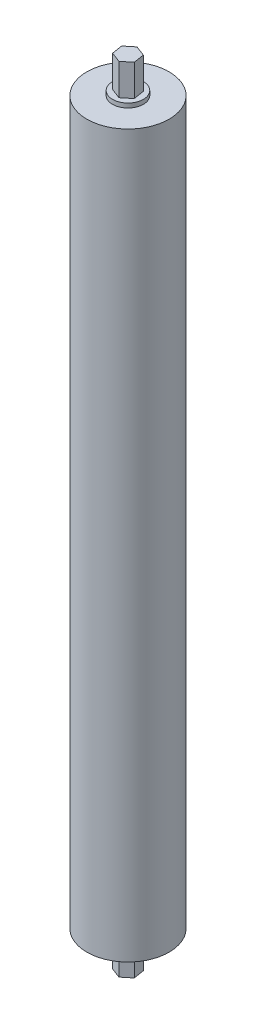
ISO-10303-21;
HEADER;
FILE_DESCRIPTION(('STEP AP214'),'2;1');
FILE_NAME('part.step','',(''),(''),'','','');
FILE_SCHEMA(('AUTOMOTIVE_DESIGN { 1 0 10303 214 1 1 1 1 }'));
ENDSEC;
DATA;
#1=APPLICATION_CONTEXT('core data for automotive mechanical design processes');
#2=APPLICATION_PROTOCOL_DEFINITION('international standard','automotive_design',2000,#1);
#3=PRODUCT_CONTEXT('',#1,'mechanical');
#4=PRODUCT('Part','Part','',(#3));
#5=PRODUCT_RELATED_PRODUCT_CATEGORY('part','',(#4));
#6=PRODUCT_DEFINITION_FORMATION('','',#4);
#7=PRODUCT_DEFINITION_CONTEXT('part definition',#1,'design');
#8=PRODUCT_DEFINITION('design','',#6,#7);
#9=PRODUCT_DEFINITION_SHAPE('','',#8);
#10=(LENGTH_UNIT() NAMED_UNIT(*) SI_UNIT(.MILLI.,.METRE.));
#11=(NAMED_UNIT(*) PLANE_ANGLE_UNIT() SI_UNIT($,.RADIAN.));
#12=(NAMED_UNIT(*) SI_UNIT($,.STERADIAN.) SOLID_ANGLE_UNIT());
#13=UNCERTAINTY_MEASURE_WITH_UNIT(LENGTH_MEASURE(1.E-05),#10,'distance_accuracy_value','');
#14=(GEOMETRIC_REPRESENTATION_CONTEXT(3) GLOBAL_UNCERTAINTY_ASSIGNED_CONTEXT((#13)) GLOBAL_UNIT_ASSIGNED_CONTEXT((#10,
#11,#12)) REPRESENTATION_CONTEXT('',''));
#15=CARTESIAN_POINT('',(0.,0.,0.));
#16=DIRECTION('',(0.,0.,1.));
#17=DIRECTION('',(1.,0.,0.));
#18=AXIS2_PLACEMENT_3D('',#15,#16,#17);
#19=CARTESIAN_POINT('',(0.,213.5505,0.));
#20=DIRECTION('',(0.,1.,0.));
#21=DIRECTION('',(0.,0.,1.));
#22=AXIS2_PLACEMENT_3D('',#19,#20,#21);
#23=PLANE('',#22);
#24=CARTESIAN_POINT('',(0.,213.5505,0.));
#25=DIRECTION('',(0.,1.,0.));
#26=DIRECTION('',(0.,0.,1.));
#27=AXIS2_PLACEMENT_3D('',#24,#25,#26);
#28=CIRCLE('',#27,9.017);
#29=CARTESIAN_POINT('',(0.,213.5505,9.017));
#30=VERTEX_POINT('',#29);
#31=EDGE_CURVE('E227',#30,#30,#28,.T.);
#32=ORIENTED_EDGE('',*,*,#31,.T.);
#33=EDGE_LOOP('',(#32));
#34=FACE_BOUND('',#33,.T.);
#35=DIRECTION('',(-0.160007938251702,0.,-0.987115727610719));
#36=VECTOR('',#35,1.);
#37=CARTESIAN_POINT('',(5.96367760674939,213.5505,2.26451239845487));
#38=LINE('',#37,#36);
#39=CARTESIAN_POINT('',(5.96367760674939,213.5505,2.26451239845487));
#40=VERTEX_POINT('',#39);
#41=CARTESIAN_POINT('',(4.94296406762144,213.5505,-4.03244010819793));
#42=VERTEX_POINT('',#41);
#43=EDGE_CURVE('E201',#40,#42,#38,.T.);
#44=ORIENTED_EDGE('',*,*,#43,.F.);
#45=DIRECTION('',(0.774863327460192,0.,-0.632128803138506));
#46=VECTOR('',#45,1.);
#47=CARTESIAN_POINT('',(1.02071353912795,213.5505,6.29695250665279));
#48=LINE('',#47,#46);
#49=CARTESIAN_POINT('',(1.02071353912795,213.5505,6.29695250665279));
#50=VERTEX_POINT('',#49);
#51=EDGE_CURVE('E183',#50,#40,#48,.T.);
#52=ORIENTED_EDGE('',*,*,#51,.F.);
#53=DIRECTION('',(0.934871265711894,0.,0.354986924472214));
#54=VECTOR('',#53,1.);
#55=CARTESIAN_POINT('',(-4.94296406762144,213.5505,4.03244010819792));
#56=LINE('',#55,#54);
#57=CARTESIAN_POINT('',(-4.94296406762144,213.5505,4.03244010819793));
#58=VERTEX_POINT('',#57);
#59=EDGE_CURVE('E188',#58,#50,#56,.T.);
#60=ORIENTED_EDGE('',*,*,#59,.F.);
#61=DIRECTION('',(0.160007938251702,0.,0.987115727610719));
#62=VECTOR('',#61,1.);
#63=CARTESIAN_POINT('',(-5.9636776067494,213.5505,-2.26451239845487));
#64=LINE('',#63,#62);
#65=CARTESIAN_POINT('',(-5.9636776067494,213.5505,-2.26451239845487));
#66=VERTEX_POINT('',#65);
#67=EDGE_CURVE('E207',#66,#58,#64,.T.);
#68=ORIENTED_EDGE('',*,*,#67,.F.);
#69=DIRECTION('',(-0.774863327460192,0.,0.632128803138506));
#70=VECTOR('',#69,1.);
#71=CARTESIAN_POINT('',(-1.02071353912795,213.5505,-6.29695250665279));
#72=LINE('',#71,#70);
#73=CARTESIAN_POINT('',(-1.02071353912795,213.5505,-6.29695250665279));
#74=VERTEX_POINT('',#73);
#75=EDGE_CURVE('E205',#74,#66,#72,.T.);
#76=ORIENTED_EDGE('',*,*,#75,.F.);
#77=DIRECTION('',(-0.934871265711894,0.,-0.354986924472214));
#78=VECTOR('',#77,1.);
#79=CARTESIAN_POINT('',(4.94296406762144,213.5505,-4.03244010819793));
#80=LINE('',#79,#78);
#81=EDGE_CURVE('E203',#42,#74,#80,.T.);
#82=ORIENTED_EDGE('',*,*,#81,.F.);
#83=EDGE_LOOP('',(#44,#52,#60,#68,#76,#82));
#84=FACE_BOUND('',#83,.T.);
#85=ADVANCED_FACE('F35',(#34,#84),#23,.T.);
#86=CARTESIAN_POINT('',(0.,211.0105,0.));
#87=DIRECTION('',(0.,1.,0.));
#88=DIRECTION('',(0.,0.,1.));
#89=AXIS2_PLACEMENT_3D('',#86,#87,#88);
#90=PLANE('',#89);
#91=CARTESIAN_POINT('',(0.,211.0105,0.));
#92=DIRECTION('',(0.,1.,0.));
#93=DIRECTION('',(0.,0.,1.));
#94=AXIS2_PLACEMENT_3D('',#91,#92,#93);
#95=CIRCLE('',#94,24.0411);
#96=CARTESIAN_POINT('',(0.,211.0105,24.0411));
#97=VERTEX_POINT('',#96);
#98=EDGE_CURVE('E43',#97,#97,#95,.T.);
#99=ORIENTED_EDGE('',*,*,#98,.T.);
#100=EDGE_LOOP('',(#99));
#101=FACE_BOUND('',#100,.T.);
#102=CARTESIAN_POINT('',(0.,211.0105,0.));
#103=DIRECTION('',(0.,1.,0.));
#104=DIRECTION('',(0.,0.,1.));
#105=AXIS2_PLACEMENT_3D('',#102,#103,#104);
#106=CIRCLE('',#105,9.017);
#107=CARTESIAN_POINT('',(0.,211.0105,9.017));
#108=VERTEX_POINT('',#107);
#109=EDGE_CURVE('E226',#108,#108,#106,.T.);
#110=ORIENTED_EDGE('',*,*,#109,.F.);
#111=EDGE_LOOP('',(#110));
#112=FACE_BOUND('',#111,.T.);
#113=ADVANCED_FACE('F234',(#101,#112),#90,.T.);
#114=CARTESIAN_POINT('',(0.,211.0105,0.));
#115=DIRECTION('',(0.,-1.,0.));
#116=DIRECTION('',(0.,0.,-1.));
#117=AXIS2_PLACEMENT_3D('',#114,#115,#116);
#118=CYLINDRICAL_SURFACE('',#117,24.0411);
#119=ORIENTED_EDGE('',*,*,#98,.F.);
#120=EDGE_LOOP('',(#119));
#121=FACE_BOUND('',#120,.T.);
#122=CARTESIAN_POINT('',(0.,-211.0105,0.));
#123=DIRECTION('',(0.,1.,0.));
#124=DIRECTION('',(0.,0.,1.));
#125=AXIS2_PLACEMENT_3D('',#122,#123,#124);
#126=CIRCLE('',#125,24.0411);
#127=CARTESIAN_POINT('',(0.,-211.0105,24.0411));
#128=VERTEX_POINT('',#127);
#129=EDGE_CURVE('E180',#128,#128,#126,.T.);
#130=ORIENTED_EDGE('',*,*,#129,.T.);
#131=EDGE_LOOP('',(#130));
#132=FACE_BOUND('',#131,.T.);
#133=ADVANCED_FACE('F37',(#121,#132),#118,.T.);
#134=CARTESIAN_POINT('',(0.,213.5505,0.));
#135=DIRECTION('',(0.,-1.,0.));
#136=DIRECTION('',(0.,0.,-1.));
#137=AXIS2_PLACEMENT_3D('',#134,#135,#136);
#138=CYLINDRICAL_SURFACE('',#137,9.017);
#139=ORIENTED_EDGE('',*,*,#31,.F.);
#140=EDGE_LOOP('',(#139));
#141=FACE_BOUND('',#140,.T.);
#142=ORIENTED_EDGE('',*,*,#109,.T.);
#143=EDGE_LOOP('',(#142));
#144=FACE_BOUND('',#143,.T.);
#145=ADVANCED_FACE('F239',(#141,#144),#138,.T.);
#146=CARTESIAN_POINT('',(1.02071353912795,231.9655,6.29695250665279));
#147=DIRECTION('',(-0.632128803138506,0.,-0.774863327460192));
#148=DIRECTION('',(-0.774863327460192,0.,0.632128803138506));
#149=AXIS2_PLACEMENT_3D('',#146,#147,#148);
#150=PLANE('',#149);
#151=ORIENTED_EDGE('',*,*,#51,.T.);
#152=DIRECTION('',(0.,-1.,0.));
#153=VECTOR('',#152,1.);
#154=CARTESIAN_POINT('',(5.96367760674939,231.9655,2.26451239845487));
#155=LINE('',#154,#153);
#156=CARTESIAN_POINT('',(5.96367760674939,231.9655,2.26451239845487));
#157=VERTEX_POINT('',#156);
#158=EDGE_CURVE('E224',#157,#40,#155,.T.);
#159=ORIENTED_EDGE('',*,*,#158,.F.);
#160=DIRECTION('',(0.774863327460192,0.,-0.632128803138506));
#161=VECTOR('',#160,1.);
#162=CARTESIAN_POINT('',(1.02071353912795,231.9655,6.29695250665279));
#163=LINE('',#162,#161);
#164=CARTESIAN_POINT('',(1.02071353912795,231.9655,6.29695250665279));
#165=VERTEX_POINT('',#164);
#166=EDGE_CURVE('E184',#165,#157,#163,.T.);
#167=ORIENTED_EDGE('',*,*,#166,.F.);
#168=DIRECTION('',(0.,-1.,0.));
#169=VECTOR('',#168,1.);
#170=CARTESIAN_POINT('',(1.02071353912795,231.9655,6.29695250665279));
#171=LINE('',#170,#169);
#172=EDGE_CURVE('E198',#165,#50,#171,.T.);
#173=ORIENTED_EDGE('',*,*,#172,.T.);
#174=EDGE_LOOP('',(#151,#159,#167,#173));
#175=FACE_BOUND('',#174,.T.);
#176=ADVANCED_FACE('F268',(#175),#150,.F.);
#177=CARTESIAN_POINT('',(5.96367760674939,231.9655,2.26451239845487));
#178=DIRECTION('',(-0.987115727610719,0.,0.160007938251702));
#179=DIRECTION('',(0.160007938251702,0.,0.987115727610719));
#180=AXIS2_PLACEMENT_3D('',#177,#178,#179);
#181=PLANE('',#180);
#182=ORIENTED_EDGE('',*,*,#43,.T.);
#183=DIRECTION('',(0.,-1.,0.));
#184=VECTOR('',#183,1.);
#185=CARTESIAN_POINT('',(4.94296406762144,231.9655,-4.03244010819793));
#186=LINE('',#185,#184);
#187=CARTESIAN_POINT('',(4.94296406762144,231.9655,-4.03244010819793));
#188=VERTEX_POINT('',#187);
#189=EDGE_CURVE('E221',#188,#42,#186,.T.);
#190=ORIENTED_EDGE('',*,*,#189,.F.);
#191=DIRECTION('',(-0.160007938251702,0.,-0.987115727610719));
#192=VECTOR('',#191,1.);
#193=CARTESIAN_POINT('',(5.96367760674939,231.9655,2.26451239845487));
#194=LINE('',#193,#192);
#195=EDGE_CURVE('E187',#157,#188,#194,.T.);
#196=ORIENTED_EDGE('',*,*,#195,.F.);
#197=ORIENTED_EDGE('',*,*,#158,.T.);
#198=EDGE_LOOP('',(#182,#190,#196,#197));
#199=FACE_BOUND('',#198,.T.);
#200=ADVANCED_FACE('F275',(#199),#181,.F.);
#201=CARTESIAN_POINT('',(4.94296406762144,231.9655,-4.03244010819793));
#202=DIRECTION('',(-0.354986924472214,0.,0.934871265711894));
#203=DIRECTION('',(0.934871265711894,0.,0.354986924472214));
#204=AXIS2_PLACEMENT_3D('',#201,#202,#203);
#205=PLANE('',#204);
#206=ORIENTED_EDGE('',*,*,#81,.T.);
#207=DIRECTION('',(0.,-1.,0.));
#208=VECTOR('',#207,1.);
#209=CARTESIAN_POINT('',(-1.02071353912795,231.9655,-6.29695250665279));
#210=LINE('',#209,#208);
#211=CARTESIAN_POINT('',(-1.02071353912795,231.9655,-6.29695250665279));
#212=VERTEX_POINT('',#211);
#213=EDGE_CURVE('E218',#212,#74,#210,.T.);
#214=ORIENTED_EDGE('',*,*,#213,.F.);
#215=DIRECTION('',(-0.934871265711894,0.,-0.354986924472214));
#216=VECTOR('',#215,1.);
#217=CARTESIAN_POINT('',(4.94296406762144,231.9655,-4.03244010819793));
#218=LINE('',#217,#216);
#219=EDGE_CURVE('E190',#188,#212,#218,.T.);
#220=ORIENTED_EDGE('',*,*,#219,.F.);
#221=ORIENTED_EDGE('',*,*,#189,.T.);
#222=EDGE_LOOP('',(#206,#214,#220,#221));
#223=FACE_BOUND('',#222,.T.);
#224=ADVANCED_FACE('F283',(#223),#205,.F.);
#225=CARTESIAN_POINT('',(-1.02071353912795,231.9655,-6.29695250665279));
#226=DIRECTION('',(0.632128803138506,0.,0.774863327460192));
#227=DIRECTION('',(0.774863327460192,0.,-0.632128803138506));
#228=AXIS2_PLACEMENT_3D('',#225,#226,#227);
#229=PLANE('',#228);
#230=ORIENTED_EDGE('',*,*,#75,.T.);
#231=DIRECTION('',(0.,-1.,0.));
#232=VECTOR('',#231,1.);
#233=CARTESIAN_POINT('',(-5.9636776067494,231.9655,-2.26451239845487));
#234=LINE('',#233,#232);
#235=CARTESIAN_POINT('',(-5.9636776067494,231.9655,-2.26451239845487));
#236=VERTEX_POINT('',#235);
#237=EDGE_CURVE('E215',#236,#66,#234,.T.);
#238=ORIENTED_EDGE('',*,*,#237,.F.);
#239=DIRECTION('',(-0.774863327460192,0.,0.632128803138506));
#240=VECTOR('',#239,1.);
#241=CARTESIAN_POINT('',(-1.02071353912795,231.9655,-6.29695250665279));
#242=LINE('',#241,#240);
#243=EDGE_CURVE('E192',#212,#236,#242,.T.);
#244=ORIENTED_EDGE('',*,*,#243,.F.);
#245=ORIENTED_EDGE('',*,*,#213,.T.);
#246=EDGE_LOOP('',(#230,#238,#244,#245));
#247=FACE_BOUND('',#246,.T.);
#248=ADVANCED_FACE('F307',(#247),#229,.F.);
#249=CARTESIAN_POINT('',(-5.9636776067494,231.9655,-2.26451239845487));
#250=DIRECTION('',(0.987115727610719,0.,-0.160007938251702));
#251=DIRECTION('',(-0.160007938251702,0.,-0.987115727610719));
#252=AXIS2_PLACEMENT_3D('',#249,#250,#251);
#253=PLANE('',#252);
#254=ORIENTED_EDGE('',*,*,#67,.T.);
#255=DIRECTION('',(0.,-1.,0.));
#256=VECTOR('',#255,1.);
#257=CARTESIAN_POINT('',(-4.94296406762144,231.9655,4.03244010819792));
#258=LINE('',#257,#256);
#259=CARTESIAN_POINT('',(-4.94296406762144,231.9655,4.03244010819792));
#260=VERTEX_POINT('',#259);
#261=EDGE_CURVE('E213',#260,#58,#258,.T.);
#262=ORIENTED_EDGE('',*,*,#261,.F.);
#263=DIRECTION('',(0.160007938251702,0.,0.987115727610719));
#264=VECTOR('',#263,1.);
#265=CARTESIAN_POINT('',(-5.9636776067494,231.9655,-2.26451239845487));
#266=LINE('',#265,#264);
#267=EDGE_CURVE('E194',#236,#260,#266,.T.);
#268=ORIENTED_EDGE('',*,*,#267,.F.);
#269=ORIENTED_EDGE('',*,*,#237,.T.);
#270=EDGE_LOOP('',(#254,#262,#268,#269));
#271=FACE_BOUND('',#270,.T.);
#272=ADVANCED_FACE('F305',(#271),#253,.F.);
#273=CARTESIAN_POINT('',(-4.94296406762144,231.9655,4.03244010819792));
#274=DIRECTION('',(0.354986924472214,0.,-0.934871265711894));
#275=DIRECTION('',(-0.934871265711894,0.,-0.354986924472214));
#276=AXIS2_PLACEMENT_3D('',#273,#274,#275);
#277=PLANE('',#276);
#278=ORIENTED_EDGE('',*,*,#59,.T.);
#279=ORIENTED_EDGE('',*,*,#172,.F.);
#280=DIRECTION('',(0.934871265711894,0.,0.354986924472214));
#281=VECTOR('',#280,1.);
#282=CARTESIAN_POINT('',(-4.94296406762144,231.9655,4.03244010819792));
#283=LINE('',#282,#281);
#284=EDGE_CURVE('E196',#260,#165,#283,.T.);
#285=ORIENTED_EDGE('',*,*,#284,.F.);
#286=ORIENTED_EDGE('',*,*,#261,.T.);
#287=EDGE_LOOP('',(#278,#279,#285,#286));
#288=FACE_BOUND('',#287,.T.);
#289=ADVANCED_FACE('F255',(#288),#277,.F.);
#290=CARTESIAN_POINT('',(0.,231.9655,0.));
#291=DIRECTION('',(0.,1.,0.));
#292=DIRECTION('',(0.,0.,1.));
#293=AXIS2_PLACEMENT_3D('',#290,#291,#292);
#294=PLANE('',#293);
#295=ORIENTED_EDGE('',*,*,#166,.T.);
#296=ORIENTED_EDGE('',*,*,#195,.T.);
#297=ORIENTED_EDGE('',*,*,#219,.T.);
#298=ORIENTED_EDGE('',*,*,#243,.T.);
#299=ORIENTED_EDGE('',*,*,#267,.T.);
#300=ORIENTED_EDGE('',*,*,#284,.T.);
#301=EDGE_LOOP('',(#295,#296,#297,#298,#299,#300));
#302=FACE_BOUND('',#301,.T.);
#303=ADVANCED_FACE('F245',(#302),#294,.T.);
#304=CARTESIAN_POINT('',(0.,-211.0105,0.));
#305=DIRECTION('',(0.,-1.,0.));
#306=DIRECTION('',(0.,0.,1.));
#307=AXIS2_PLACEMENT_3D('',#304,#305,#306);
#308=PLANE('',#307);
#309=CARTESIAN_POINT('',(0.,-211.0105,0.));
#310=DIRECTION('',(0.,-1.,0.));
#311=DIRECTION('',(0.,0.,-1.));
#312=AXIS2_PLACEMENT_3D('',#309,#310,#311);
#313=CIRCLE('',#312,9.017);
#314=CARTESIAN_POINT('',(0.,-211.0105,-9.017));
#315=VERTEX_POINT('',#314);
#316=EDGE_CURVE('E11',#315,#315,#313,.T.);
#317=ORIENTED_EDGE('',*,*,#316,.F.);
#318=EDGE_LOOP('',(#317));
#319=FACE_BOUND('',#318,.T.);
#320=ORIENTED_EDGE('',*,*,#129,.F.);
#321=EDGE_LOOP('',(#320));
#322=FACE_BOUND('',#321,.T.);
#323=ADVANCED_FACE('F242',(#319,#322),#308,.T.);
#324=CARTESIAN_POINT('',(0.,-213.5505,0.));
#325=DIRECTION('',(0.,1.,0.));
#326=DIRECTION('',(0.,0.,1.));
#327=AXIS2_PLACEMENT_3D('',#324,#325,#326);
#328=CYLINDRICAL_SURFACE('',#327,9.017);
#329=CARTESIAN_POINT('',(0.,-213.5505,0.));
#330=DIRECTION('',(0.,1.,0.));
#331=DIRECTION('',(0.,0.,1.));
#332=AXIS2_PLACEMENT_3D('',#329,#330,#331);
#333=CIRCLE('',#332,9.017);
#334=CARTESIAN_POINT('',(0.,-213.5505,9.017));
#335=VERTEX_POINT('',#334);
#336=EDGE_CURVE('E132',#335,#335,#333,.T.);
#337=ORIENTED_EDGE('',*,*,#336,.T.);
#338=EDGE_LOOP('',(#337));
#339=FACE_BOUND('',#338,.T.);
#340=ORIENTED_EDGE('',*,*,#316,.T.);
#341=EDGE_LOOP('',(#340));
#342=FACE_BOUND('',#341,.T.);
#343=ADVANCED_FACE('F244',(#339,#342),#328,.T.);
#344=CARTESIAN_POINT('',(0.,-213.5505,0.));
#345=DIRECTION('',(0.,-1.,0.));
#346=DIRECTION('',(0.,0.,1.));
#347=AXIS2_PLACEMENT_3D('',#344,#345,#346);
#348=PLANE('',#347);
#349=DIRECTION('',(0.774863327460192,0.,-0.632128803138506));
#350=VECTOR('',#349,1.);
#351=CARTESIAN_POINT('',(1.02071353912795,-213.5505,6.29695250665279));
#352=LINE('',#351,#350);
#353=CARTESIAN_POINT('',(1.02071353912795,-213.5505,6.29695250665279));
#354=VERTEX_POINT('',#353);
#355=CARTESIAN_POINT('',(5.96367760674939,-213.5505,2.26451239845487));
#356=VERTEX_POINT('',#355);
#357=EDGE_CURVE('E129',#354,#356,#352,.T.);
#358=ORIENTED_EDGE('',*,*,#357,.T.);
#359=DIRECTION('',(-0.160007938251702,0.,-0.987115727610719));
#360=VECTOR('',#359,1.);
#361=CARTESIAN_POINT('',(5.96367760674939,-213.5505,2.26451239845487));
#362=LINE('',#361,#360);
#363=CARTESIAN_POINT('',(4.94296406762144,-213.5505,-4.03244010819793));
#364=VERTEX_POINT('',#363);
#365=EDGE_CURVE('E144',#356,#364,#362,.T.);
#366=ORIENTED_EDGE('',*,*,#365,.T.);
#367=DIRECTION('',(-0.934871265711894,0.,-0.354986924472214));
#368=VECTOR('',#367,1.);
#369=CARTESIAN_POINT('',(4.94296406762144,-213.5505,-4.03244010819793));
#370=LINE('',#369,#368);
#371=CARTESIAN_POINT('',(-1.02071353912795,-213.5505,-6.29695250665279));
#372=VERTEX_POINT('',#371);
#373=EDGE_CURVE('E164',#364,#372,#370,.T.);
#374=ORIENTED_EDGE('',*,*,#373,.T.);
#375=DIRECTION('',(-0.774863327460192,0.,0.632128803138506));
#376=VECTOR('',#375,1.);
#377=CARTESIAN_POINT('',(-1.02071353912795,-213.5505,-6.29695250665279));
#378=LINE('',#377,#376);
#379=CARTESIAN_POINT('',(-5.9636776067494,-213.5505,-2.26451239845487));
#380=VERTEX_POINT('',#379);
#381=EDGE_CURVE('E162',#372,#380,#378,.T.);
#382=ORIENTED_EDGE('',*,*,#381,.T.);
#383=DIRECTION('',(0.160007938251702,0.,0.987115727610719));
#384=VECTOR('',#383,1.);
#385=CARTESIAN_POINT('',(-5.9636776067494,-213.5505,-2.26451239845487));
#386=LINE('',#385,#384);
#387=CARTESIAN_POINT('',(-4.94296406762144,-213.5505,4.03244010819792));
#388=VERTEX_POINT('',#387);
#389=EDGE_CURVE('E55',#380,#388,#386,.T.);
#390=ORIENTED_EDGE('',*,*,#389,.T.);
#391=DIRECTION('',(0.934871265711894,0.,0.354986924472214));
#392=VECTOR('',#391,1.);
#393=CARTESIAN_POINT('',(-4.94296406762144,-213.5505,4.03244010819792));
#394=LINE('',#393,#392);
#395=EDGE_CURVE('E50',#388,#354,#394,.T.);
#396=ORIENTED_EDGE('',*,*,#395,.T.);
#397=EDGE_LOOP('',(#358,#366,#374,#382,#390,#396));
#398=FACE_BOUND('',#397,.T.);
#399=ORIENTED_EDGE('',*,*,#336,.F.);
#400=EDGE_LOOP('',(#399));
#401=FACE_BOUND('',#400,.T.);
#402=ADVANCED_FACE('F252',(#398,#401),#348,.T.);
#403=CARTESIAN_POINT('',(1.02071353912795,-231.9655,6.29695250665279));
#404=DIRECTION('',(0.632128803138506,0.,0.774863327460192));
#405=DIRECTION('',(0.774863327460192,0.,-0.632128803138506));
#406=AXIS2_PLACEMENT_3D('',#403,#404,#405);
#407=PLANE('',#406);
#408=ORIENTED_EDGE('',*,*,#357,.F.);
#409=DIRECTION('',(0.,1.,0.));
#410=VECTOR('',#409,1.);
#411=CARTESIAN_POINT('',(1.02071353912795,-231.9655,6.29695250665279));
#412=LINE('',#411,#410);
#413=CARTESIAN_POINT('',(1.02071353912795,-231.9655,6.29695250665279));
#414=VERTEX_POINT('',#413);
#415=EDGE_CURVE('E123',#414,#354,#412,.T.);
#416=ORIENTED_EDGE('',*,*,#415,.F.);
#417=DIRECTION('',(0.774863327460192,0.,-0.632128803138506));
#418=VECTOR('',#417,1.);
#419=CARTESIAN_POINT('',(1.02071353912795,-231.9655,6.29695250665279));
#420=LINE('',#419,#418);
#421=CARTESIAN_POINT('',(5.96367760674939,-231.9655,2.26451239845487));
#422=VERTEX_POINT('',#421);
#423=EDGE_CURVE('E127',#414,#422,#420,.T.);
#424=ORIENTED_EDGE('',*,*,#423,.T.);
#425=DIRECTION('',(0.,1.,0.));
#426=VECTOR('',#425,1.);
#427=CARTESIAN_POINT('',(5.96367760674939,-231.9655,2.26451239845487));
#428=LINE('',#427,#426);
#429=EDGE_CURVE('E158',#422,#356,#428,.T.);
#430=ORIENTED_EDGE('',*,*,#429,.T.);
#431=EDGE_LOOP('',(#408,#416,#424,#430));
#432=FACE_BOUND('',#431,.T.);
#433=ADVANCED_FACE('F125',(#432),#407,.T.);
#434=CARTESIAN_POINT('',(-4.94296406762144,-231.9655,4.03244010819792));
#435=DIRECTION('',(-0.354986924472214,0.,0.934871265711894));
#436=DIRECTION('',(0.934871265711894,0.,0.354986924472214));
#437=AXIS2_PLACEMENT_3D('',#434,#435,#436);
#438=PLANE('',#437);
#439=ORIENTED_EDGE('',*,*,#395,.F.);
#440=DIRECTION('',(0.,1.,0.));
#441=VECTOR('',#440,1.);
#442=CARTESIAN_POINT('',(-4.94296406762144,-231.9655,4.03244010819792));
#443=LINE('',#442,#441);
#444=CARTESIAN_POINT('',(-4.94296406762144,-231.9655,4.03244010819792));
#445=VERTEX_POINT('',#444);
#446=EDGE_CURVE('E133',#445,#388,#443,.T.);
#447=ORIENTED_EDGE('',*,*,#446,.F.);
#448=DIRECTION('',(0.934871265711894,0.,0.354986924472214));
#449=VECTOR('',#448,1.);
#450=CARTESIAN_POINT('',(-4.94296406762144,-231.9655,4.03244010819792));
#451=LINE('',#450,#449);
#452=EDGE_CURVE('E139',#445,#414,#451,.T.);
#453=ORIENTED_EDGE('',*,*,#452,.T.);
#454=ORIENTED_EDGE('',*,*,#415,.T.);
#455=EDGE_LOOP('',(#439,#447,#453,#454));
#456=FACE_BOUND('',#455,.T.);
#457=ADVANCED_FACE('F146',(#456),#438,.T.);
#458=CARTESIAN_POINT('',(-5.9636776067494,-231.9655,-2.26451239845487));
#459=DIRECTION('',(-0.987115727610719,0.,0.160007938251702));
#460=DIRECTION('',(0.160007938251702,0.,0.987115727610719));
#461=AXIS2_PLACEMENT_3D('',#458,#459,#460);
#462=PLANE('',#461);
#463=ORIENTED_EDGE('',*,*,#389,.F.);
#464=DIRECTION('',(0.,1.,0.));
#465=VECTOR('',#464,1.);
#466=CARTESIAN_POINT('',(-5.9636776067494,-231.9655,-2.26451239845487));
#467=LINE('',#466,#465);
#468=CARTESIAN_POINT('',(-5.9636776067494,-231.9655,-2.26451239845487));
#469=VERTEX_POINT('',#468);
#470=EDGE_CURVE('E174',#469,#380,#467,.T.);
#471=ORIENTED_EDGE('',*,*,#470,.F.);
#472=DIRECTION('',(0.160007938251702,0.,0.987115727610719));
#473=VECTOR('',#472,1.);
#474=CARTESIAN_POINT('',(-5.9636776067494,-231.9655,-2.26451239845487));
#475=LINE('',#474,#473);
#476=EDGE_CURVE('E147',#469,#445,#475,.T.);
#477=ORIENTED_EDGE('',*,*,#476,.T.);
#478=ORIENTED_EDGE('',*,*,#446,.T.);
#479=EDGE_LOOP('',(#463,#471,#477,#478));
#480=FACE_BOUND('',#479,.T.);
#481=ADVANCED_FACE('F368',(#480),#462,.T.);
#482=CARTESIAN_POINT('',(-1.02071353912795,-231.9655,-6.29695250665279));
#483=DIRECTION('',(-0.632128803138506,0.,-0.774863327460192));
#484=DIRECTION('',(-0.774863327460192,0.,0.632128803138506));
#485=AXIS2_PLACEMENT_3D('',#482,#483,#484);
#486=PLANE('',#485);
#487=ORIENTED_EDGE('',*,*,#381,.F.);
#488=DIRECTION('',(0.,1.,0.));
#489=VECTOR('',#488,1.);
#490=CARTESIAN_POINT('',(-1.02071353912795,-231.9655,-6.29695250665279));
#491=LINE('',#490,#489);
#492=CARTESIAN_POINT('',(-1.02071353912795,-231.9655,-6.29695250665279));
#493=VERTEX_POINT('',#492);
#494=EDGE_CURVE('E171',#493,#372,#491,.T.);
#495=ORIENTED_EDGE('',*,*,#494,.F.);
#496=DIRECTION('',(-0.774863327460192,0.,0.632128803138506));
#497=VECTOR('',#496,1.);
#498=CARTESIAN_POINT('',(-1.02071353912795,-231.9655,-6.29695250665279));
#499=LINE('',#498,#497);
#500=EDGE_CURVE('E149',#493,#469,#499,.T.);
#501=ORIENTED_EDGE('',*,*,#500,.T.);
#502=ORIENTED_EDGE('',*,*,#470,.T.);
#503=EDGE_LOOP('',(#487,#495,#501,#502));
#504=FACE_BOUND('',#503,.T.);
#505=ADVANCED_FACE('F377',(#504),#486,.T.);
#506=CARTESIAN_POINT('',(4.94296406762144,-231.9655,-4.03244010819793));
#507=DIRECTION('',(0.354986924472214,0.,-0.934871265711894));
#508=DIRECTION('',(-0.934871265711894,0.,-0.354986924472214));
#509=AXIS2_PLACEMENT_3D('',#506,#507,#508);
#510=PLANE('',#509);
#511=ORIENTED_EDGE('',*,*,#373,.F.);
#512=DIRECTION('',(0.,1.,0.));
#513=VECTOR('',#512,1.);
#514=CARTESIAN_POINT('',(4.94296406762144,-231.9655,-4.03244010819793));
#515=LINE('',#514,#513);
#516=CARTESIAN_POINT('',(4.94296406762144,-231.9655,-4.03244010819793));
#517=VERTEX_POINT('',#516);
#518=EDGE_CURVE('E168',#517,#364,#515,.T.);
#519=ORIENTED_EDGE('',*,*,#518,.F.);
#520=DIRECTION('',(-0.934871265711894,0.,-0.354986924472214));
#521=VECTOR('',#520,1.);
#522=CARTESIAN_POINT('',(4.94296406762144,-231.9655,-4.03244010819793));
#523=LINE('',#522,#521);
#524=EDGE_CURVE('E154',#517,#493,#523,.T.);
#525=ORIENTED_EDGE('',*,*,#524,.T.);
#526=ORIENTED_EDGE('',*,*,#494,.T.);
#527=EDGE_LOOP('',(#511,#519,#525,#526));
#528=FACE_BOUND('',#527,.T.);
#529=ADVANCED_FACE('F387',(#528),#510,.T.);
#530=CARTESIAN_POINT('',(5.96367760674939,-231.9655,2.26451239845487));
#531=DIRECTION('',(0.987115727610719,0.,-0.160007938251702));
#532=DIRECTION('',(-0.160007938251702,0.,-0.987115727610719));
#533=AXIS2_PLACEMENT_3D('',#530,#531,#532);
#534=PLANE('',#533);
#535=ORIENTED_EDGE('',*,*,#365,.F.);
#536=ORIENTED_EDGE('',*,*,#429,.F.);
#537=DIRECTION('',(-0.160007938251702,0.,-0.987115727610719));
#538=VECTOR('',#537,1.);
#539=CARTESIAN_POINT('',(5.96367760674939,-231.9655,2.26451239845487));
#540=LINE('',#539,#538);
#541=EDGE_CURVE('E143',#422,#517,#540,.T.);
#542=ORIENTED_EDGE('',*,*,#541,.T.);
#543=ORIENTED_EDGE('',*,*,#518,.T.);
#544=EDGE_LOOP('',(#535,#536,#542,#543));
#545=FACE_BOUND('',#544,.T.);
#546=ADVANCED_FACE('F397',(#545),#534,.T.);
#547=CARTESIAN_POINT('',(0.,-231.9655,0.));
#548=DIRECTION('',(0.,-1.,0.));
#549=DIRECTION('',(0.,0.,1.));
#550=AXIS2_PLACEMENT_3D('',#547,#548,#549);
#551=PLANE('',#550);
#552=ORIENTED_EDGE('',*,*,#423,.F.);
#553=ORIENTED_EDGE('',*,*,#452,.F.);
#554=ORIENTED_EDGE('',*,*,#476,.F.);
#555=ORIENTED_EDGE('',*,*,#500,.F.);
#556=ORIENTED_EDGE('',*,*,#524,.F.);
#557=ORIENTED_EDGE('',*,*,#541,.F.);
#558=EDGE_LOOP('',(#552,#553,#554,#555,#556,#557));
#559=FACE_BOUND('',#558,.T.);
#560=ADVANCED_FACE('F137',(#559),#551,.T.);
#561=CLOSED_SHELL('',(#85,#113,#133,#145,#176,#200,#224,#248,#272,#289,#303,#323,#343,#402,#433,
#457,#481,#505,#529,#546,#560));
#562=MANIFOLD_SOLID_BREP('B2',#561);
#563=ADVANCED_BREP_SHAPE_REPRESENTATION('',(#18,#562),#14);
#564=SHAPE_DEFINITION_REPRESENTATION(#9,#563);
ENDSEC;
END-ISO-10303-21;
